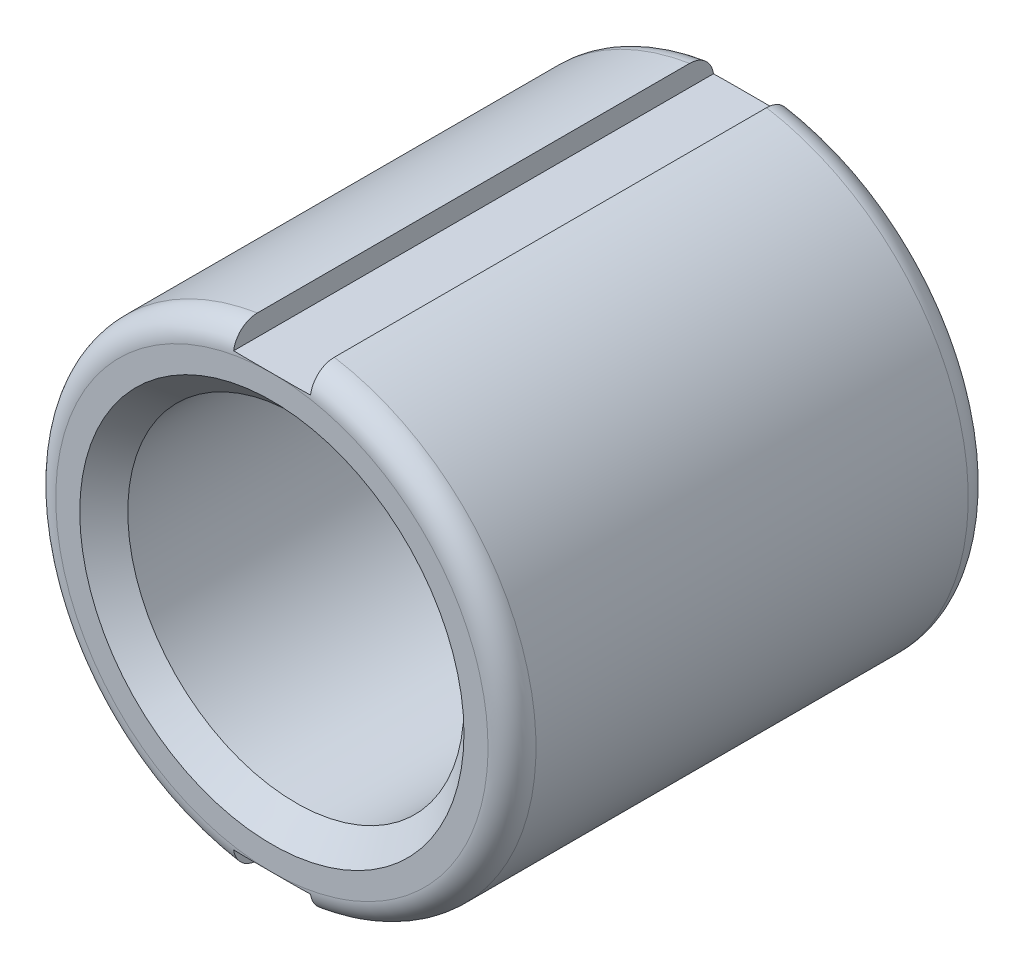
ISO-10303-21;
HEADER;
FILE_DESCRIPTION(('STEP AP214'),'2;1');
FILE_NAME('part.step','',(''),(''),'','','');
FILE_SCHEMA(('AUTOMOTIVE_DESIGN { 1 0 10303 214 1 1 1 1 }'));
ENDSEC;
DATA;
#1=APPLICATION_CONTEXT('core data for automotive mechanical design processes');
#2=APPLICATION_PROTOCOL_DEFINITION('international standard','automotive_design',2000,#1);
#3=PRODUCT_CONTEXT('',#1,'mechanical');
#4=PRODUCT('Part','Part','',(#3));
#5=PRODUCT_RELATED_PRODUCT_CATEGORY('part','',(#4));
#6=PRODUCT_DEFINITION_FORMATION('','',#4);
#7=PRODUCT_DEFINITION_CONTEXT('part definition',#1,'design');
#8=PRODUCT_DEFINITION('design','',#6,#7);
#9=PRODUCT_DEFINITION_SHAPE('','',#8);
#10=(LENGTH_UNIT() NAMED_UNIT(*) SI_UNIT(.MILLI.,.METRE.));
#11=(NAMED_UNIT(*) PLANE_ANGLE_UNIT() SI_UNIT($,.RADIAN.));
#12=(NAMED_UNIT(*) SI_UNIT($,.STERADIAN.) SOLID_ANGLE_UNIT());
#13=UNCERTAINTY_MEASURE_WITH_UNIT(LENGTH_MEASURE(1.E-05),#10,'distance_accuracy_value','');
#14=(GEOMETRIC_REPRESENTATION_CONTEXT(3) GLOBAL_UNCERTAINTY_ASSIGNED_CONTEXT((#13)) GLOBAL_UNIT_ASSIGNED_CONTEXT((#10,
#11,#12)) REPRESENTATION_CONTEXT('',''));
#15=CARTESIAN_POINT('',(0.,0.,0.));
#16=DIRECTION('',(0.,0.,1.));
#17=DIRECTION('',(1.,0.,0.));
#18=AXIS2_PLACEMENT_3D('',#15,#16,#17);
#19=CARTESIAN_POINT('',(0.,0.,0.));
#20=DIRECTION('',(0.,0.,1.));
#21=DIRECTION('',(1.,0.,0.));
#22=AXIS2_PLACEMENT_3D('',#19,#20,#21);
#23=CYLINDRICAL_SURFACE('',#22,5.);
#24=DIRECTION('',(0.,0.,-1.));
#25=VECTOR('',#24,1.);
#26=CARTESIAN_POINT('',(0.8,4.93558507170123,10.));
#27=LINE('',#26,#25);
#28=CARTESIAN_POINT('',(0.8,4.93558507170123,0.5));
#29=VERTEX_POINT('',#28);
#30=CARTESIAN_POINT('',(0.8,4.93558507170123,9.5));
#31=VERTEX_POINT('',#30);
#32=EDGE_CURVE('E111',#29,#31,#27,.F.);
#33=ORIENTED_EDGE('',*,*,#32,.T.);
#34=CARTESIAN_POINT('',(0.,0.,9.5));
#35=DIRECTION('',(0.,0.,1.));
#36=DIRECTION('',(1.,0.,0.));
#37=AXIS2_PLACEMENT_3D('',#34,#35,#36);
#38=CIRCLE('',#37,5.);
#39=CARTESIAN_POINT('',(0.8,-4.93558507170123,9.5));
#40=VERTEX_POINT('',#39);
#41=EDGE_CURVE('E209',#40,#31,#38,.T.);
#42=ORIENTED_EDGE('',*,*,#41,.F.);
#43=DIRECTION('',(0.,0.,-1.));
#44=VECTOR('',#43,1.);
#45=CARTESIAN_POINT('',(0.8,-4.93558507170123,10.));
#46=LINE('',#45,#44);
#47=CARTESIAN_POINT('',(0.8,-4.93558507170123,0.5));
#48=VERTEX_POINT('',#47);
#49=EDGE_CURVE('E210',#40,#48,#46,.T.);
#50=ORIENTED_EDGE('',*,*,#49,.T.);
#51=CARTESIAN_POINT('',(0.,0.,0.5));
#52=DIRECTION('',(0.,0.,-1.));
#53=DIRECTION('',(-1.,0.,0.));
#54=AXIS2_PLACEMENT_3D('',#51,#52,#53);
#55=CIRCLE('',#54,5.);
#56=EDGE_CURVE('E215',#29,#48,#55,.T.);
#57=ORIENTED_EDGE('',*,*,#56,.F.);
#58=EDGE_LOOP('',(#33,#42,#50,#57));
#59=FACE_BOUND('',#58,.T.);
#60=ADVANCED_FACE('F17',(#59),#23,.T.);
#61=CARTESIAN_POINT('',(0.,0.,0.));
#62=DIRECTION('',(0.,0.,1.));
#63=DIRECTION('',(1.,0.,0.));
#64=AXIS2_PLACEMENT_3D('',#61,#62,#63);
#65=CYLINDRICAL_SURFACE('',#64,3.5);
#66=CARTESIAN_POINT('',(0.,0.,0.500000668296252));
#67=DIRECTION('',(0.,0.,-1.));
#68=DIRECTION('',(-1.,0.,0.));
#69=AXIS2_PLACEMENT_3D('',#66,#67,#68);
#70=CIRCLE('',#69,3.5000015562332);
#71=CARTESIAN_POINT('',(-3.5000015562332,0.,0.500000668296252));
#72=VERTEX_POINT('',#71);
#73=EDGE_CURVE('E330',#72,#72,#70,.T.);
#74=ORIENTED_EDGE('',*,*,#73,.T.);
#75=EDGE_LOOP('',(#74));
#76=FACE_BOUND('',#75,.T.);
#77=CARTESIAN_POINT('',(0.,0.,9.4999993317515));
#78=DIRECTION('',(0.,0.,1.));
#79=DIRECTION('',(1.,0.,0.));
#80=AXIS2_PLACEMENT_3D('',#77,#78,#79);
#81=CIRCLE('',#80,3.50000155606267);
#82=CARTESIAN_POINT('',(3.50000155606267,0.,9.4999993317515));
#83=VERTEX_POINT('',#82);
#84=EDGE_CURVE('E188',#83,#83,#81,.T.);
#85=ORIENTED_EDGE('',*,*,#84,.T.);
#86=EDGE_LOOP('',(#85));
#87=FACE_BOUND('',#86,.T.);
#88=ADVANCED_FACE('F220',(#76,#87),#65,.F.);
#89=CARTESIAN_POINT('',(0.8,4.5,10.));
#90=DIRECTION('',(1.,0.,0.));
#91=DIRECTION('',(0.,0.,-1.));
#92=AXIS2_PLACEMENT_3D('',#89,#90,#91);
#93=PLANE('',#92);
#94=ORIENTED_EDGE('',*,*,#32,.F.);
#95=CARTESIAN_POINT('',(0.8,4.50000000000039,0.00500345930993872));
#96=CARTESIAN_POINT('',(0.8,4.52845009813169,0.00897273757396105));
#97=CARTESIAN_POINT('',(0.8,4.55655801465725,0.0153662200912822));
#98=CARTESIAN_POINT('',(0.8,4.6113130072945,0.0327443842024068));
#99=CARTESIAN_POINT('',(0.8,4.63796027567464,0.0437284598763442));
#100=CARTESIAN_POINT('',(0.8,4.68904531073149,0.0700420339840328));
#101=CARTESIAN_POINT('',(0.8,4.7134813391354,0.0853749125676671));
#102=CARTESIAN_POINT('',(0.8,4.75938912629864,0.119956087856805));
#103=CARTESIAN_POINT('',(0.8,4.78086228503292,0.139202524672923));
#104=CARTESIAN_POINT('',(0.8,4.82001371761876,0.180875086695023));
#105=CARTESIAN_POINT('',(0.8,4.83772714171255,0.203268178644543));
#106=CARTESIAN_POINT('',(0.8,4.86909323858901,0.250758707019667));
#107=CARTESIAN_POINT('',(0.8,4.88274369521804,0.275857609205382));
#108=CARTESIAN_POINT('',(0.8,4.90540198417884,0.327686969604477));
#109=CARTESIAN_POINT('',(0.8,4.91446651788921,0.354392689625114));
#110=CARTESIAN_POINT('',(0.8,4.92791605870243,0.408913776939777));
#111=CARTESIAN_POINT('',(0.8,4.93231064652914,0.436726750452957));
#112=CARTESIAN_POINT('',(0.8,4.93516504033238,0.476441709655943));
#113=CARTESIAN_POINT('',(0.8,4.93558824778079,0.48822420578162));
#114=CARTESIAN_POINT('',(0.8,4.93558507170123,0.500000000000001));
#115=B_SPLINE_CURVE_WITH_KNOTS('',3,(#95,#96,#97,#98,#99,#100,#101,#102,#103,#104,#105,#106,
#107,#108,#109,#110,#111,#112,#113,#114),.UNSPECIFIED.,.F.,.F.,(4,2,2,2,2,2,2,2,2,4),(0.,
0.0860724566878337,0.17213355611815,0.258261731565756,0.344349070505498,0.429592175522784,
0.514881691710011,0.59908918782297,0.683123590796544,0.718461358191967),.UNSPECIFIED.);
#116=CARTESIAN_POINT('',(0.800000000000035,4.5000000000002,0.00500345930991209));
#117=VERTEX_POINT('',#116);
#118=EDGE_CURVE('E110',#117,#29,#115,.T.);
#119=ORIENTED_EDGE('',*,*,#118,.F.);
#120=DIRECTION('',(0.,0.,-1.));
#121=VECTOR('',#120,1.);
#122=CARTESIAN_POINT('',(0.8,4.5,10.));
#123=LINE('',#122,#121);
#124=CARTESIAN_POINT('',(0.8,4.5,9.99499654069011));
#125=VERTEX_POINT('',#124);
#126=EDGE_CURVE('E303',#117,#125,#123,.F.);
#127=ORIENTED_EDGE('',*,*,#126,.T.);
#128=CARTESIAN_POINT('',(0.8,4.93558507170123,9.5));
#129=CARTESIAN_POINT('',(0.8,4.93561032605787,9.52785775098437));
#130=CARTESIAN_POINT('',(0.8,4.93322810088451,9.55570642255943));
#131=CARTESIAN_POINT('',(0.8,4.92383695412796,9.61058367841181));
#132=CARTESIAN_POINT('',(0.8,4.9168328966941,9.63761309365178));
#133=CARTESIAN_POINT('',(0.8,4.89838214868909,9.6901215937765));
#134=CARTESIAN_POINT('',(0.8,4.88693378418782,9.71560009032633));
#135=CARTESIAN_POINT('',(0.8,4.85994796647418,9.76428229447974));
#136=CARTESIAN_POINT('',(0.8,4.84441125855866,9.78748641564033));
#137=CARTESIAN_POINT('',(0.8,4.80961256302529,9.83110500215733));
#138=CARTESIAN_POINT('',(0.8,4.7903317823694,9.85150446843207));
#139=CARTESIAN_POINT('',(0.8,4.74864614825345,9.88883476826517));
#140=CARTESIAN_POINT('',(0.8,4.72623960256491,9.9057637106067));
#141=CARTESIAN_POINT('',(0.8,4.67864142629612,9.93589509562028));
#142=CARTESIAN_POINT('',(0.8,4.65341749533544,9.94904645778509));
#143=CARTESIAN_POINT('',(0.8,4.60117360135183,9.97096883261647));
#144=CARTESIAN_POINT('',(0.8,4.57415655687601,9.97974677468078));
#145=CARTESIAN_POINT('',(0.8,4.53121938353573,9.98988187728597));
#146=CARTESIAN_POINT('',(0.8,4.51565627458967,9.99280454830524));
#147=CARTESIAN_POINT('',(0.8,4.5,9.99499654069012));
#148=B_SPLINE_CURVE_WITH_KNOTS('',3,(#128,#129,#130,#131,#132,#133,#134,#135,#136,#137,#138,
#139,#140,#141,#142,#143,#144,#145,#146,#147),.UNSPECIFIED.,.F.,.F.,(4,2,2,2,2,2,2,2,2,4),(0.,
0.0834582007003239,0.166828707373504,0.250230645721877,0.333617390583583,0.417434043094357,
0.50129624969402,0.586244135819235,0.67105699611958,0.718490994234366),.UNSPECIFIED.);
#149=EDGE_CURVE('E189',#31,#125,#148,.T.);
#150=ORIENTED_EDGE('',*,*,#149,.F.);
#151=EDGE_LOOP('',(#94,#119,#127,#150));
#152=FACE_BOUND('',#151,.T.);
#153=ADVANCED_FACE('F216',(#152),#93,.F.);
#154=CARTESIAN_POINT('',(0.,0.,0.499999999999998));
#155=DIRECTION('',(0.,0.,1.));
#156=DIRECTION('',(1.,0.,0.));
#157=AXIS2_PLACEMENT_3D('',#154,#155,#156);
#158=TOROIDAL_SURFACE('',#157,4.5,0.499999999999999);
#159=ORIENTED_EDGE('',*,*,#56,.T.);
#160=CARTESIAN_POINT('',(0.8,-4.93558507170123,0.5));
#161=CARTESIAN_POINT('',(0.8,-4.93561032605788,0.472142249015626));
#162=CARTESIAN_POINT('',(0.8,-4.93322810088451,0.444293577440572));
#163=CARTESIAN_POINT('',(0.8,-4.92383695412796,0.389416321588187));
#164=CARTESIAN_POINT('',(0.8,-4.9168328966941,0.362386906348221));
#165=CARTESIAN_POINT('',(0.8,-4.89838214868909,0.309878406223494));
#166=CARTESIAN_POINT('',(0.8,-4.88693378418783,0.284399909673671));
#167=CARTESIAN_POINT('',(0.8,-4.85994796647419,0.235717705520259));
#168=CARTESIAN_POINT('',(0.8,-4.84441125855866,0.212513584359669));
#169=CARTESIAN_POINT('',(0.8,-4.80961256302529,0.168894997842669));
#170=CARTESIAN_POINT('',(0.8,-4.7903317823694,0.148495531567928));
#171=CARTESIAN_POINT('',(0.8,-4.74864614825345,0.111165231734834));
#172=CARTESIAN_POINT('',(0.8,-4.72623960256491,0.0942362893933036));
#173=CARTESIAN_POINT('',(0.8,-4.67864142629612,0.0641049043797164));
#174=CARTESIAN_POINT('',(0.8,-4.65341749533544,0.0509535422149144));
#175=CARTESIAN_POINT('',(0.8,-4.60117360135183,0.029031167383524));
#176=CARTESIAN_POINT('',(0.8,-4.57415655687601,0.0202532253192213));
#177=CARTESIAN_POINT('',(0.8,-4.53121938353573,0.01011812271403));
#178=CARTESIAN_POINT('',(0.8,-4.51565627458967,0.00719545169475767));
#179=CARTESIAN_POINT('',(0.8,-4.5,0.0050034593098837));
#180=B_SPLINE_CURVE_WITH_KNOTS('',3,(#160,#161,#162,#163,#164,#165,#166,#167,#168,#169,#170,
#171,#172,#173,#174,#175,#176,#177,#178,#179),.UNSPECIFIED.,.F.,.F.,(4,2,2,2,2,2,2,2,2,4),(0.,
0.0834582007003237,0.166828707373503,0.250230645721875,0.333617390583583,0.417434043094357,
0.501296249694018,0.586244135819233,0.67105699611958,0.71849099423437),.UNSPECIFIED.);
#181=CARTESIAN_POINT('',(0.8,-4.5,0.00500345930988396));
#182=VERTEX_POINT('',#181);
#183=EDGE_CURVE('E108',#48,#182,#180,.T.);
#184=ORIENTED_EDGE('',*,*,#183,.T.);
#185=CARTESIAN_POINT('',(0.8,-4.5,0.00500345930988385));
#186=CARTESIAN_POINT('',(0.733344506557293,-4.5,0.0033663492276476));
#187=CARTESIAN_POINT('',(0.666680551744092,-4.5,0.00229903633764223));
#188=CARTESIAN_POINT('',(0.533346670210533,-4.5,0.000878165482210462));
#189=CARTESIAN_POINT('',(0.466676743790579,-4.5,0.000524581887966322));
#190=CARTESIAN_POINT('',(0.333340130833498,-4.5,0.000105283347925185));
#191=CARTESIAN_POINT('',(0.266673444287652,-4.5,3.95552367685691E-05));
#192=CARTESIAN_POINT('',(0.133337899336369,-4.5,-8.2602312148946E-08));
#193=CARTESIAN_POINT('',(0.066669040928656,-4.5,2.60105615179282E-05));
#194=CARTESIAN_POINT('',(1.49090468649038E-08,-4.5,0.));
#195=B_SPLINE_CURVE_WITH_KNOTS('',3,(#185,#186,#187,#188,#189,#190,#191,#192,#193,#194),
.UNSPECIFIED.,.F.,.F.,(4,2,2,2,4),(0.,0.200016739061593,0.400026295730958,0.600026704666838,
0.800033412330266),.UNSPECIFIED.);
#196=CARTESIAN_POINT('',(9.93936330502778E-09,-4.50000000007172,0.));
#197=VERTEX_POINT('',#196);
#198=EDGE_CURVE('E22',#182,#197,#195,.T.);
#199=ORIENTED_EDGE('',*,*,#198,.T.);
#200=CARTESIAN_POINT('',(0.,0.,0.));
#201=DIRECTION('',(0.,0.,1.));
#202=DIRECTION('',(1.,0.,0.));
#203=AXIS2_PLACEMENT_3D('',#200,#201,#202);
#204=CIRCLE('',#203,4.50000000014344);
#205=CARTESIAN_POINT('',(-1.10222400979637E-08,4.50000000005369,0.));
#206=VERTEX_POINT('',#205);
#207=EDGE_CURVE('E105',#197,#206,#204,.T.);
#208=ORIENTED_EDGE('',*,*,#207,.T.);
#209=CARTESIAN_POINT('',(-2.20444813050395E-08,4.5,0.));
#210=CARTESIAN_POINT('',(0.0666690070545186,4.5,2.60105664174248E-05));
#211=CARTESIAN_POINT('',(0.133337868541531,4.5,-8.26023107872413E-08));
#212=CARTESIAN_POINT('',(0.26667341965142,4.5,3.95552148983217E-05));
#213=CARTESIAN_POINT('',(0.333340109276574,4.5,0.000105283309081953));
#214=CARTESIAN_POINT('',(0.466676728392722,4.5,0.000524581810621204));
#215=CARTESIAN_POINT('',(0.533346657892435,4.5,0.000878165383336557));
#216=CARTESIAN_POINT('',(0.666680545585347,4.5,0.00229903624138613));
#217=CARTESIAN_POINT('',(0.733344503478141,4.5,0.00336634915553947));
#218=CARTESIAN_POINT('',(0.800000000000071,4.5,0.00500345930988065));
#219=B_SPLINE_CURVE_WITH_KNOTS('',3,(#209,#210,#211,#212,#213,#214,#215,#216,#217,#218),
.UNSPECIFIED.,.F.,.F.,(4,2,2,2,4),(0.,0.200006716901429,0.400007135075256,0.600016700983217,
0.800033449283664),.UNSPECIFIED.);
#220=EDGE_CURVE('E190',#206,#117,#219,.T.);
#221=ORIENTED_EDGE('',*,*,#220,.T.);
#222=ORIENTED_EDGE('',*,*,#118,.T.);
#223=EDGE_LOOP('',(#159,#184,#199,#208,#221,#222));
#224=FACE_BOUND('',#223,.T.);
#225=ADVANCED_FACE('F103',(#224),#158,.T.);
#226=CARTESIAN_POINT('',(0.,0.,5.6843418860808E-11));
#227=DIRECTION('',(0.,0.,-1.));
#228=DIRECTION('',(-1.,0.,0.));
#229=AXIS2_PLACEMENT_3D('',#226,#227,#228);
#230=CONICAL_SURFACE('',#229,4.00000254222732,0.785398481151634);
#231=ORIENTED_EDGE('',*,*,#73,.F.);
#232=EDGE_LOOP('',(#231));
#233=FACE_BOUND('',#232,.T.);
#234=CARTESIAN_POINT('',(0.,0.,5.6843418860808E-11));
#235=DIRECTION('',(0.,0.,-1.));
#236=DIRECTION('',(-1.,0.,0.));
#237=AXIS2_PLACEMENT_3D('',#234,#235,#236);
#238=CIRCLE('',#237,4.00000254222732);
#239=CARTESIAN_POINT('',(-4.00000254222732,0.,5.6843418860808E-11));
#240=VERTEX_POINT('',#239);
#241=EDGE_CURVE('E118',#240,#240,#238,.T.);
#242=ORIENTED_EDGE('',*,*,#241,.T.);
#243=EDGE_LOOP('',(#242));
#244=FACE_BOUND('',#243,.T.);
#245=ADVANCED_FACE('F203',(#233,#244),#230,.F.);
#246=CARTESIAN_POINT('',(0.8,-5.5,10.));
#247=DIRECTION('',(1.,0.,0.));
#248=DIRECTION('',(0.,0.,-1.));
#249=AXIS2_PLACEMENT_3D('',#246,#247,#248);
#250=PLANE('',#249);
#251=ORIENTED_EDGE('',*,*,#49,.F.);
#252=CARTESIAN_POINT('',(0.8,-4.50000000000067,9.99499654069002));
#253=CARTESIAN_POINT('',(0.8,-4.52845009813196,9.99102726242598));
#254=CARTESIAN_POINT('',(0.8,-4.55655801465752,9.98463377990865));
#255=CARTESIAN_POINT('',(0.8,-4.61131300729476,9.96725561579749));
#256=CARTESIAN_POINT('',(0.8,-4.63796027567489,9.95627154012354));
#257=CARTESIAN_POINT('',(0.8,-4.68904531073172,9.92995796601583));
#258=CARTESIAN_POINT('',(0.8,-4.71348133913562,9.91462508743218));
#259=CARTESIAN_POINT('',(0.8,-4.75938912629885,9.88004391214302));
#260=CARTESIAN_POINT('',(0.8,-4.78086228503312,9.86079747532689));
#261=CARTESIAN_POINT('',(0.8,-4.82001371761894,9.81912491330477));
#262=CARTESIAN_POINT('',(0.8,-4.83772714171271,9.79673182135524));
#263=CARTESIAN_POINT('',(0.8,-4.86909323858914,9.7492412929801));
#264=CARTESIAN_POINT('',(0.8,-4.88274369521817,9.72414239079438));
#265=CARTESIAN_POINT('',(0.8,-4.90540198417894,9.67231303039527));
#266=CARTESIAN_POINT('',(0.8,-4.91446651788929,9.64560731037463));
#267=CARTESIAN_POINT('',(0.8,-4.92791605870248,9.59108622305996));
#268=CARTESIAN_POINT('',(0.8,-4.93231064652917,9.56327324954678));
#269=CARTESIAN_POINT('',(0.8,-4.93516504033239,9.52355829034388));
#270=CARTESIAN_POINT('',(0.8,-4.93558824778079,9.51177579421829));
#271=CARTESIAN_POINT('',(0.8,-4.93558507170123,9.5));
#272=B_SPLINE_CURVE_WITH_KNOTS('',3,(#252,#253,#254,#255,#256,#257,#258,#259,#260,#261,#262,
#263,#264,#265,#266,#267,#268,#269,#270,#271),.UNSPECIFIED.,.F.,.F.,(4,2,2,2,2,2,2,2,2,4),(0.,
0.086072456687831,0.172133556118147,0.258261731565753,0.344349070505492,0.429592175522776,
0.514881691710001,0.599089187822962,0.683123590796533,0.718461358191688),.UNSPECIFIED.);
#273=CARTESIAN_POINT('',(0.80000000000006,-4.50000000000033,9.99499654069007));
#274=VERTEX_POINT('',#273);
#275=EDGE_CURVE('E182',#274,#40,#272,.T.);
#276=ORIENTED_EDGE('',*,*,#275,.F.);
#277=DIRECTION('',(0.,0.,1.));
#278=VECTOR('',#277,1.);
#279=CARTESIAN_POINT('',(0.800000000000001,-4.5,10.));
#280=LINE('',#279,#278);
#281=EDGE_CURVE('E151',#274,#182,#280,.F.);
#282=ORIENTED_EDGE('',*,*,#281,.T.);
#283=ORIENTED_EDGE('',*,*,#183,.F.);
#284=EDGE_LOOP('',(#251,#276,#282,#283));
#285=FACE_BOUND('',#284,.T.);
#286=ADVANCED_FACE('F164',(#285),#250,.F.);
#287=CARTESIAN_POINT('',(0.,0.,9.5));
#288=DIRECTION('',(0.,0.,1.));
#289=DIRECTION('',(1.,0.,0.));
#290=AXIS2_PLACEMENT_3D('',#287,#288,#289);
#291=TOROIDAL_SURFACE('',#290,4.5,0.5);
#292=CARTESIAN_POINT('',(1.62758198528307E-05,-4.50000005458983,10.0000000545898));
#293=CARTESIAN_POINT('',(0.066683946777847,-4.50000001971275,9.99997401130688));
#294=CARTESIAN_POINT('',(0.133351450166399,-4.50000000530721,10.0000000879096));
#295=CARTESIAN_POINT('',(0.266684285084998,-4.49999999469296,9.99996042983179));
#296=CARTESIAN_POINT('',(0.333349616617321,-4.49999999848367,9.99989469804262));
#297=CARTESIAN_POINT('',(0.466683519390653,-4.5000000015164,9.99947538559313));
#298=CARTESIAN_POINT('',(0.533352090640376,-4.50000000075821,9.99912179176711));
#299=CARTESIAN_POINT('',(0.666683261862751,-4.49999999924176,9.9977009205472));
#300=CARTESIAN_POINT('',(0.733345861535006,-4.49999999848349,9.99663361752556));
#301=CARTESIAN_POINT('',(0.800000000000121,-4.5,9.99499654069012));
#302=B_SPLINE_CURVE_WITH_KNOTS('',3,(#292,#293,#294,#295,#296,#297,#298,#299,#300,#301),
.UNSPECIFIED.,.F.,.F.,(4,2,2,2,4),(0.,0.200002642564528,0.399998986447587,0.600004477907052,
0.800017151513118),.UNSPECIFIED.);
#303=CARTESIAN_POINT('',(1.30206558823996E-05,-4.50000017456554,10.));
#304=VERTEX_POINT('',#303);
#305=EDGE_CURVE('E144',#304,#274,#302,.T.);
#306=ORIENTED_EDGE('',*,*,#305,.T.);
#307=ORIENTED_EDGE('',*,*,#275,.T.);
#308=ORIENTED_EDGE('',*,*,#41,.T.);
#309=ORIENTED_EDGE('',*,*,#149,.T.);
#310=CARTESIAN_POINT('',(0.800000000000001,4.5,9.99499654069012));
#311=CARTESIAN_POINT('',(0.733343131936565,4.5,9.99663368296244));
#312=CARTESIAN_POINT('',(0.66667780233715,4.5,9.99770100663277));
#313=CARTESIAN_POINT('',(0.533341171156878,4.5,9.99912187865667));
#314=CARTESIAN_POINT('',(0.466669869876428,4.5,9.99947545263968));
#315=CARTESIAN_POINT('',(0.333330507400085,4.5,9.99989473399157));
#316=CARTESIAN_POINT('',(0.266662446195466,4.5,9.99996045452587));
#317=CARTESIAN_POINT('',(0.133324151930512,4.5,10.0000000826015));
#318=CARTESIAN_POINT('',(0.0666539188679005,4.5,9.99997398725129));
#319=CARTESIAN_POINT('',(-1.64818476221269E-05,4.5,10.));
#320=B_SPLINE_CURVE_WITH_KNOTS('',3,(#310,#311,#312,#313,#314,#315,#316,#317,#318,#319),
.UNSPECIFIED.,.F.,.F.,(4,2,2,2,4),(0.,0.200020863453622,0.400034544399552,0.60003907732304,
0.800049908997521),.UNSPECIFIED.);
#321=CARTESIAN_POINT('',(-1.64804799260263E-05,4.5000001097127,9.99999999999997));
#322=VERTEX_POINT('',#321);
#323=EDGE_CURVE('E174',#125,#322,#320,.T.);
#324=ORIENTED_EDGE('',*,*,#323,.T.);
#325=CARTESIAN_POINT('',(1.62758198530875E-05,-4.50000021820692,10.));
#326=CARTESIAN_POINT('',(0.857851058751881,-4.49999736531634,10.));
#327=CARTESIAN_POINT('',(1.65644149103543,-4.18404167162007,10.));
#328=CARTESIAN_POINT('',(2.07972243957404,-4.01657406830617,10.));
#329=CARTESIAN_POINT('',(2.46245775763847,-3.76647117339286,10.));
#330=CARTESIAN_POINT('',(2.85168483583712,-3.51212616147069,10.));
#331=CARTESIAN_POINT('',(3.1819923370543,-3.18196923243312,10.));
#332=CARTESIAN_POINT('',(3.5108332042635,-2.85327826883174,10.));
#333=CARTESIAN_POINT('',(3.76648907052002,-2.46243042024408,10.));
#334=CARTESIAN_POINT('',(4.01561923659616,-2.08155909170807,10.));
#335=CARTESIAN_POINT('',(4.18405373919687,-1.65641112798503,10.));
#336=CARTESIAN_POINT('',(4.49980561761339,-0.859417245628622,10.));
#337=CARTESIAN_POINT('',(4.50000039144437,1.63781499126769E-05,10.));
#338=CARTESIAN_POINT('',(4.50019468992715,0.857352542368111,10.));
#339=CARTESIAN_POINT('',(4.18404168177605,1.65644158445212,10.));
#340=CARTESIAN_POINT('',(4.0165740567291,2.07972252952823,10.));
#341=CARTESIAN_POINT('',(3.76647114595305,2.46245783726888,10.));
#342=CARTESIAN_POINT('',(3.51212611640777,2.85168490725083,10.));
#343=CARTESIAN_POINT('',(3.18196917485231,3.18199239499163,10.));
#344=CARTESIAN_POINT('',(2.85327819769278,3.51083324988062,10.));
#345=CARTESIAN_POINT('',(2.4624303407623,3.76648909864916,10.));
#346=CARTESIAN_POINT('',(2.08155892675873,4.01561929827073,10.));
#347=CARTESIAN_POINT('',(1.65641103461087,4.18405373019566,10.));
#348=CARTESIAN_POINT('',(0.858917432259905,4.50000350757108,10.));
#349=CARTESIAN_POINT('',(-1.64804799263147E-05,4.50000021942539,10.));
#350=B_SPLINE_CURVE_WITH_KNOTS('',2,(#325,#326,#327,#328,#329,#330,#331,#332,#333,#334,#335,
#336,#337,#338,#339,#340,#341,#342,#343,#344,#345,#346,#347,#348,#349),.UNSPECIFIED.,.F.,.F.,(3,
2,2,2,2,2,2,2,2,2,2,2,3),(0.,0.125,0.1875,0.25,0.3125,0.375,0.5,0.625,0.6875,0.75,0.8125,0.875,
1.),.UNSPECIFIED.);
#351=EDGE_CURVE('E143',#304,#322,#350,.T.);
#352=ORIENTED_EDGE('',*,*,#351,.F.);
#353=EDGE_LOOP('',(#306,#307,#308,#309,#324,#352));
#354=FACE_BOUND('',#353,.T.);
#355=ADVANCED_FACE('F160',(#354),#291,.T.);
#356=CARTESIAN_POINT('',(0.,0.,9.99999999993406));
#357=DIRECTION('',(0.,0.,1.));
#358=DIRECTION('',(1.,0.,0.));
#359=AXIS2_PLACEMENT_3D('',#356,#357,#358);
#360=CONICAL_SURFACE('',#359,4.00000254199995,0.785398481094791);
#361=ORIENTED_EDGE('',*,*,#84,.F.);
#362=EDGE_LOOP('',(#361));
#363=FACE_BOUND('',#362,.T.);
#364=CARTESIAN_POINT('',(0.,0.,9.99999999999091));
#365=DIRECTION('',(0.,0.,1.));
#366=DIRECTION('',(1.,0.,0.));
#367=AXIS2_PLACEMENT_3D('',#364,#365,#366);
#368=CIRCLE('',#367,4.00000254205679);
#369=CARTESIAN_POINT('',(4.00000254205679,0.,9.99999999999091));
#370=VERTEX_POINT('',#369);
#371=EDGE_CURVE('E134',#370,#370,#368,.F.);
#372=ORIENTED_EDGE('',*,*,#371,.F.);
#373=EDGE_LOOP('',(#372));
#374=FACE_BOUND('',#373,.T.);
#375=ADVANCED_FACE('F163',(#363,#374),#360,.F.);
#376=CARTESIAN_POINT('',(-0.8,4.5,10.));
#377=DIRECTION('',(0.,-1.,0.));
#378=DIRECTION('',(0.,0.,-1.));
#379=AXIS2_PLACEMENT_3D('',#376,#377,#378);
#380=PLANE('',#379);
#381=DIRECTION('',(0.,0.,1.));
#382=VECTOR('',#381,1.);
#383=CARTESIAN_POINT('',(-0.8,4.5,10.));
#384=LINE('',#383,#382);
#385=CARTESIAN_POINT('',(-0.8,4.5,0.00500345930988523));
#386=VERTEX_POINT('',#385);
#387=CARTESIAN_POINT('',(-0.80000000000006,4.5,9.99499654069011));
#388=VERTEX_POINT('',#387);
#389=EDGE_CURVE('E131',#386,#388,#384,.T.);
#390=ORIENTED_EDGE('',*,*,#389,.T.);
#391=CARTESIAN_POINT('',(-1.64804799259004E-05,4.50000005481825,10.0000000548182));
#392=CARTESIAN_POINT('',(-0.0666841343832538,4.50000001979523,9.99997401141649));
#393=CARTESIAN_POINT('',(-0.133351620717657,4.50000000532942,10.0000000879318));
#394=CARTESIAN_POINT('',(-0.266684421527948,4.49999999467075,9.99996042968845));
#395=CARTESIAN_POINT('',(-0.333349736006114,4.49999999847732,9.99989469782114));
#396=CARTESIAN_POINT('',(-0.466683604668805,4.50000000152275,9.9994753851711));
#397=CARTESIAN_POINT('',(-0.533352158862044,4.50000000076139,9.99912179122267));
#398=CARTESIAN_POINT('',(-0.666683295972188,4.49999999923859,9.99770092001092));
#399=CARTESIAN_POINT('',(-0.733345878588697,4.49999999847715,9.99663361711985));
#400=CARTESIAN_POINT('',(-0.80000000000012,4.5,9.99499654069012));
#401=B_SPLINE_CURVE_WITH_KNOTS('',3,(#391,#392,#393,#394,#395,#396,#397,#398,#399,#400),
.UNSPECIFIED.,.F.,.F.,(4,2,2,2,4),(0.,0.200002591401523,0.399998884121964,0.600004324415762,
0.800016946854176),.UNSPECIFIED.);
#402=EDGE_CURVE('E296',#322,#388,#401,.T.);
#403=ORIENTED_EDGE('',*,*,#402,.F.);
#404=ORIENTED_EDGE('',*,*,#323,.F.);
#405=ORIENTED_EDGE('',*,*,#126,.F.);
#406=ORIENTED_EDGE('',*,*,#220,.F.);
#407=CARTESIAN_POINT('',(-0.799999999999999,4.5,0.00500345930988524));
#408=CARTESIAN_POINT('',(-0.733344507151864,4.5,0.00336634924157253));
#409=CARTESIAN_POINT('',(-0.666680552933308,4.5,0.0022990363562301));
#410=CARTESIAN_POINT('',(-0.533346672589069,4.5,0.000878165501303778));
#411=CARTESIAN_POINT('',(-0.466676746763792,4.5,0.000524581902902408));
#412=CARTESIAN_POINT('',(-0.333340134995976,4.5,0.000105283355426737));
#413=CARTESIAN_POINT('',(-0.266673449044718,4.5,3.95552409928393E-05));
#414=CARTESIAN_POINT('',(-0.133337905282612,4.5,-8.26023109671498E-08));
#415=CARTESIAN_POINT('',(-0.0666690474694857,4.5,2.60105605733977E-05));
#416=CARTESIAN_POINT('',(-2.20444814776575E-08,4.5,0.));
#417=B_SPLINE_CURVE_WITH_KNOTS('',3,(#407,#408,#409,#410,#411,#412,#413,#414,#415,#416),
.UNSPECIFIED.,.F.,.F.,(4,2,2,2,4),(0.,0.200016737277647,0.400026292163115,0.600026699315223,
0.800033405194869),.UNSPECIFIED.);
#418=EDGE_CURVE('E119',#386,#206,#417,.T.);
#419=ORIENTED_EDGE('',*,*,#418,.F.);
#420=EDGE_LOOP('',(#390,#403,#404,#405,#406,#419));
#421=FACE_BOUND('',#420,.T.);
#422=ADVANCED_FACE('F297',(#421),#380,.F.);
#423=CARTESIAN_POINT('',(0.,0.,0.));
#424=DIRECTION('',(0.,0.,1.));
#425=DIRECTION('',(1.,0.,0.));
#426=AXIS2_PLACEMENT_3D('',#423,#424,#425);
#427=PLANE('',#426);
#428=ORIENTED_EDGE('',*,*,#241,.F.);
#429=EDGE_LOOP('',(#428));
#430=FACE_BOUND('',#429,.T.);
#431=CARTESIAN_POINT('',(0.,0.,0.));
#432=DIRECTION('',(0.,0.,1.));
#433=DIRECTION('',(0.,-1.,0.));
#434=AXIS2_PLACEMENT_3D('',#431,#432,#433);
#435=CIRCLE('',#434,4.50000000010738);
#436=EDGE_CURVE('E116',#206,#197,#435,.T.);
#437=ORIENTED_EDGE('',*,*,#436,.F.);
#438=ORIENTED_EDGE('',*,*,#207,.F.);
#439=EDGE_LOOP('',(#437,#438));
#440=FACE_BOUND('',#439,.T.);
#441=ADVANCED_FACE('F114',(#430,#440),#427,.F.);
#442=CARTESIAN_POINT('',(0.8,-4.5,10.));
#443=DIRECTION('',(0.,1.,0.));
#444=DIRECTION('',(0.,0.,1.));
#445=AXIS2_PLACEMENT_3D('',#442,#443,#444);
#446=PLANE('',#445);
#447=ORIENTED_EDGE('',*,*,#281,.F.);
#448=ORIENTED_EDGE('',*,*,#305,.F.);
#449=CARTESIAN_POINT('',(-0.800000000000001,-4.5,9.99499654069011));
#450=CARTESIAN_POINT('',(-0.733343148990694,-4.5,9.99663368256308));
#451=CARTESIAN_POINT('',(-0.666677836447461,-4.5,9.99770100609966));
#452=CARTESIAN_POINT('',(-0.533341239380474,-4.5,9.99912187810907));
#453=CARTESIAN_POINT('',(-0.466669955157128,-4.5,9.99947545221132));
#454=CARTESIAN_POINT('',(-0.333330626792488,-4.5,9.99989473377646));
#455=CARTESIAN_POINT('',(-0.266662582642471,-4.5,9.99996045440476));
#456=CARTESIAN_POINT('',(-0.13332432248667,-4.5,10.0000000826015));
#457=CARTESIAN_POINT('',(-0.0666541064786112,-4.5,9.99997398727842));
#458=CARTESIAN_POINT('',(1.62771818500677E-05,-4.5,10.));
#459=B_SPLINE_CURVE_WITH_KNOTS('',3,(#449,#450,#451,#452,#453,#454,#455,#456,#457,#458),
.UNSPECIFIED.,.F.,.F.,(4,2,2,2,4),(0.,0.200020812284663,0.400034442063066,0.600038923822611,
0.800049704332859),.UNSPECIFIED.);
#460=CARTESIAN_POINT('',(-0.800000000000001,-4.5,9.99499654069011));
#461=VERTEX_POINT('',#460);
#462=EDGE_CURVE('E152',#461,#304,#459,.T.);
#463=ORIENTED_EDGE('',*,*,#462,.F.);
#464=DIRECTION('',(0.,0.,1.));
#465=VECTOR('',#464,1.);
#466=CARTESIAN_POINT('',(-0.8,-4.5,10.));
#467=LINE('',#466,#465);
#468=CARTESIAN_POINT('',(-0.800000000000035,-4.5,0.00500345930988579));
#469=VERTEX_POINT('',#468);
#470=EDGE_CURVE('E124',#461,#469,#467,.F.);
#471=ORIENTED_EDGE('',*,*,#470,.T.);
#472=CARTESIAN_POINT('',(1.49090467550158E-08,-4.5,0.));
#473=CARTESIAN_POINT('',(-0.0666690135953483,-4.5,2.60105654720587E-05));
#474=CARTESIAN_POINT('',(-0.133337874487773,-4.5,-8.26023103930765E-08));
#475=CARTESIAN_POINT('',(-0.266673424408487,-4.5,3.95552191219547E-05));
#476=CARTESIAN_POINT('',(-0.333340113439052,-4.5,0.00010528331658297));
#477=CARTESIAN_POINT('',(-0.466676731365935,-4.5,0.000524581825556797));
#478=CARTESIAN_POINT('',(-0.533346660270972,-4.5,0.00087816540242932));
#479=CARTESIAN_POINT('',(-0.666680546774564,-4.5,0.00229903625997338));
#480=CARTESIAN_POINT('',(-0.733344504072713,-4.5,0.00336634916946377));
#481=CARTESIAN_POINT('',(-0.800000000000071,-4.5,0.00500345930988154));
#482=B_SPLINE_CURVE_WITH_KNOTS('',3,(#472,#473,#474,#475,#476,#477,#478,#479,#480,#481),
.UNSPECIFIED.,.F.,.F.,(4,2,2,2,4),(0.,0.200006715117647,0.400007131507703,0.600016695631767,
0.800033442148268),.UNSPECIFIED.);
#483=EDGE_CURVE('E122',#197,#469,#482,.T.);
#484=ORIENTED_EDGE('',*,*,#483,.F.);
#485=ORIENTED_EDGE('',*,*,#198,.F.);
#486=EDGE_LOOP('',(#447,#448,#463,#471,#484,#485));
#487=FACE_BOUND('',#486,.T.);
#488=ADVANCED_FACE('F123',(#487),#446,.F.);
#489=CARTESIAN_POINT('',(0.,0.,10.));
#490=DIRECTION('',(0.,0.,1.));
#491=DIRECTION('',(1.,0.,0.));
#492=AXIS2_PLACEMENT_3D('',#489,#490,#491);
#493=PLANE('',#492);
#494=ORIENTED_EDGE('',*,*,#371,.T.);
#495=EDGE_LOOP('',(#494));
#496=FACE_BOUND('',#495,.T.);
#497=ORIENTED_EDGE('',*,*,#351,.T.);
#498=CARTESIAN_POINT('',(0.,0.,9.99999999999995));
#499=DIRECTION('',(0.,0.,1.));
#500=DIRECTION('',(1.,0.,0.));
#501=AXIS2_PLACEMENT_3D('',#498,#499,#500);
#502=CIRCLE('',#501,4.50000021823635);
#503=EDGE_CURVE('E292',#304,#322,#502,.F.);
#504=ORIENTED_EDGE('',*,*,#503,.F.);
#505=EDGE_LOOP('',(#497,#504));
#506=FACE_BOUND('',#505,.T.);
#507=ADVANCED_FACE('F272',(#496,#506),#493,.T.);
#508=CARTESIAN_POINT('',(-0.8,5.5,10.));
#509=DIRECTION('',(-1.,0.,0.));
#510=DIRECTION('',(0.,0.,1.));
#511=AXIS2_PLACEMENT_3D('',#508,#509,#510);
#512=PLANE('',#511);
#513=DIRECTION('',(0.,0.,1.));
#514=VECTOR('',#513,1.);
#515=CARTESIAN_POINT('',(-0.800000000000009,4.93558507170123,0.));
#516=LINE('',#515,#514);
#517=CARTESIAN_POINT('',(-0.800000000000005,4.93558507170123,9.5));
#518=VERTEX_POINT('',#517);
#519=CARTESIAN_POINT('',(-0.800000000000005,4.93558507170123,0.5));
#520=VERTEX_POINT('',#519);
#521=EDGE_CURVE('E264',#518,#520,#516,.F.);
#522=ORIENTED_EDGE('',*,*,#521,.F.);
#523=CARTESIAN_POINT('',(-0.8,4.50000000000067,9.99499654069002));
#524=CARTESIAN_POINT('',(-0.8,4.52845009813196,9.99102726242598));
#525=CARTESIAN_POINT('',(-0.8,4.55655801465752,9.98463377990865));
#526=CARTESIAN_POINT('',(-0.8,4.61131300729476,9.96725561579749));
#527=CARTESIAN_POINT('',(-0.8,4.63796027567489,9.95627154012354));
#528=CARTESIAN_POINT('',(-0.8,4.68904531073172,9.92995796601583));
#529=CARTESIAN_POINT('',(-0.8,4.71348133913562,9.91462508743218));
#530=CARTESIAN_POINT('',(-0.8,4.75938912629885,9.88004391214302));
#531=CARTESIAN_POINT('',(-0.8,4.78086228503312,9.86079747532689));
#532=CARTESIAN_POINT('',(-0.8,4.82001371761894,9.81912491330477));
#533=CARTESIAN_POINT('',(-0.8,4.83772714171271,9.79673182135524));
#534=CARTESIAN_POINT('',(-0.8,4.86909323858914,9.7492412929801));
#535=CARTESIAN_POINT('',(-0.8,4.88274369521817,9.72414239079438));
#536=CARTESIAN_POINT('',(-0.8,4.90540198417894,9.67231303039527));
#537=CARTESIAN_POINT('',(-0.8,4.91446651788929,9.64560731037463));
#538=CARTESIAN_POINT('',(-0.8,4.92791605870248,9.59108622305996));
#539=CARTESIAN_POINT('',(-0.8,4.93231064652917,9.56327324954678));
#540=CARTESIAN_POINT('',(-0.8,4.93516504033239,9.52355829034388));
#541=CARTESIAN_POINT('',(-0.8,4.93558824778079,9.51177579421829));
#542=CARTESIAN_POINT('',(-0.8,4.93558507170123,9.5));
#543=B_SPLINE_CURVE_WITH_KNOTS('',3,(#523,#524,#525,#526,#527,#528,#529,#530,#531,#532,#533,
#534,#535,#536,#537,#538,#539,#540,#541,#542),.UNSPECIFIED.,.F.,.F.,(4,2,2,2,2,2,2,2,2,4),(0.,
0.0860724566878318,0.172133556118147,0.258261731565751,0.344349070505493,0.429592175522777,
0.51488169171,0.599089187822962,0.683123590796532,0.718461358191686),.UNSPECIFIED.);
#544=EDGE_CURVE('E324',#388,#518,#543,.T.);
#545=ORIENTED_EDGE('',*,*,#544,.F.);
#546=ORIENTED_EDGE('',*,*,#389,.F.);
#547=CARTESIAN_POINT('',(-0.8,4.93558507170123,0.5));
#548=CARTESIAN_POINT('',(-0.8,4.93561032605788,0.472142249015626));
#549=CARTESIAN_POINT('',(-0.8,4.93322810088451,0.444293577440572));
#550=CARTESIAN_POINT('',(-0.8,4.92383695412796,0.389416321588187));
#551=CARTESIAN_POINT('',(-0.8,4.9168328966941,0.36238690634822));
#552=CARTESIAN_POINT('',(-0.8,4.8983821486891,0.309878406223493));
#553=CARTESIAN_POINT('',(-0.8,4.88693378418783,0.28439990967367));
#554=CARTESIAN_POINT('',(-0.8,4.85994796647419,0.235717705520258));
#555=CARTESIAN_POINT('',(-0.8,4.84441125855866,0.212513584359668));
#556=CARTESIAN_POINT('',(-0.8,4.80961256302529,0.168894997842668));
#557=CARTESIAN_POINT('',(-0.8,4.7903317823694,0.148495531567928));
#558=CARTESIAN_POINT('',(-0.8,4.74864614825345,0.111165231734833));
#559=CARTESIAN_POINT('',(-0.8,4.72623960256491,0.0942362893933025));
#560=CARTESIAN_POINT('',(-0.8,4.67864142629612,0.0641049043797156));
#561=CARTESIAN_POINT('',(-0.8,4.65341749533544,0.0509535422149139));
#562=CARTESIAN_POINT('',(-0.8,4.60117360135183,0.0290311673835241));
#563=CARTESIAN_POINT('',(-0.8,4.57415655687601,0.0202532253192217));
#564=CARTESIAN_POINT('',(-0.8,4.53121938353572,0.010118122714031));
#565=CARTESIAN_POINT('',(-0.8,4.51565627458967,0.00719545169475899));
#566=CARTESIAN_POINT('',(-0.8,4.5,0.0050034593098852));
#567=B_SPLINE_CURVE_WITH_KNOTS('',3,(#547,#548,#549,#550,#551,#552,#553,#554,#555,#556,#557,
#558,#559,#560,#561,#562,#563,#564,#565,#566),.UNSPECIFIED.,.F.,.F.,(4,2,2,2,2,2,2,2,2,4),(0.,
0.0834582007003243,0.166828707373504,0.250230645721876,0.333617390583586,0.417434043094359,
0.50129624969402,0.586244135819236,0.671056996119583,0.718490994234369),.UNSPECIFIED.);
#568=EDGE_CURVE('E127',#520,#386,#567,.T.);
#569=ORIENTED_EDGE('',*,*,#568,.F.);
#570=EDGE_LOOP('',(#522,#545,#546,#569));
#571=FACE_BOUND('',#570,.T.);
#572=ADVANCED_FACE('F244',(#571),#512,.F.);
#573=CARTESIAN_POINT('',(0.,0.,0.5));
#574=DIRECTION('',(0.,0.,1.));
#575=DIRECTION('',(0.,-1.,0.));
#576=AXIS2_PLACEMENT_3D('',#573,#574,#575);
#577=TOROIDAL_SURFACE('',#576,4.5,0.5);
#578=ORIENTED_EDGE('',*,*,#568,.T.);
#579=ORIENTED_EDGE('',*,*,#418,.T.);
#580=ORIENTED_EDGE('',*,*,#436,.T.);
#581=ORIENTED_EDGE('',*,*,#483,.T.);
#582=CARTESIAN_POINT('',(-0.8,-4.50000000000039,0.00500345930993949));
#583=CARTESIAN_POINT('',(-0.8,-4.52845009813169,0.00897273757396166));
#584=CARTESIAN_POINT('',(-0.8,-4.55655801465726,0.0153662200912828));
#585=CARTESIAN_POINT('',(-0.8,-4.6113130072945,0.0327443842024076));
#586=CARTESIAN_POINT('',(-0.8,-4.63796027567464,0.0437284598763451));
#587=CARTESIAN_POINT('',(-0.8,-4.68904531073149,0.0700420339840339));
#588=CARTESIAN_POINT('',(-0.8,-4.7134813391354,0.0853749125676682));
#589=CARTESIAN_POINT('',(-0.8,-4.75938912629864,0.119956087856806));
#590=CARTESIAN_POINT('',(-0.8,-4.78086228503293,0.139202524672924));
#591=CARTESIAN_POINT('',(-0.8,-4.82001371761876,0.180875086695024));
#592=CARTESIAN_POINT('',(-0.8,-4.83772714171255,0.203268178644544));
#593=CARTESIAN_POINT('',(-0.8,-4.86909323858901,0.250758707019668));
#594=CARTESIAN_POINT('',(-0.8,-4.88274369521805,0.275857609205384));
#595=CARTESIAN_POINT('',(-0.8,-4.90540198417884,0.327686969604478));
#596=CARTESIAN_POINT('',(-0.8,-4.91446651788922,0.354392689625116));
#597=CARTESIAN_POINT('',(-0.8,-4.92791605870243,0.40891377693978));
#598=CARTESIAN_POINT('',(-0.8,-4.93231064652914,0.43672675045296));
#599=CARTESIAN_POINT('',(-0.8,-4.93516504033239,0.476441709655945));
#600=CARTESIAN_POINT('',(-0.8,-4.93558824778079,0.48822420578162));
#601=CARTESIAN_POINT('',(-0.8,-4.93558507170123,0.5));
#602=B_SPLINE_CURVE_WITH_KNOTS('',3,(#582,#583,#584,#585,#586,#587,#588,#589,#590,#591,#592,
#593,#594,#595,#596,#597,#598,#599,#600,#601),.UNSPECIFIED.,.F.,.F.,(4,2,2,2,2,2,2,2,2,4),(0.,
0.0860724566878345,0.172133556118151,0.258261731565757,0.3443490705055,0.429592175522786,
0.514881691710013,0.599089187822973,0.683123590796548,0.718461358191967),.UNSPECIFIED.);
#603=CARTESIAN_POINT('',(-0.800000000000006,-4.93558507170123,0.5));
#604=VERTEX_POINT('',#603);
#605=EDGE_CURVE('E253',#469,#604,#602,.T.);
#606=ORIENTED_EDGE('',*,*,#605,.T.);
#607=CARTESIAN_POINT('',(0.,0.,0.5));
#608=DIRECTION('',(0.,0.,1.));
#609=DIRECTION('',(1.,0.,0.));
#610=AXIS2_PLACEMENT_3D('',#607,#608,#609);
#611=CIRCLE('',#610,5.);
#612=EDGE_CURVE('E265',#520,#604,#611,.T.);
#613=ORIENTED_EDGE('',*,*,#612,.F.);
#614=EDGE_LOOP('',(#578,#579,#580,#581,#606,#613));
#615=FACE_BOUND('',#614,.T.);
#616=ADVANCED_FACE('F130',(#615),#577,.T.);
#617=CARTESIAN_POINT('',(-0.8,-4.5,10.));
#618=DIRECTION('',(-1.,0.,0.));
#619=DIRECTION('',(0.,0.,1.));
#620=AXIS2_PLACEMENT_3D('',#617,#618,#619);
#621=PLANE('',#620);
#622=DIRECTION('',(0.,0.,1.));
#623=VECTOR('',#622,1.);
#624=CARTESIAN_POINT('',(-0.800000000000011,-4.93558507170123,0.));
#625=LINE('',#624,#623);
#626=CARTESIAN_POINT('',(-0.800000000000006,-4.93558507170123,9.5));
#627=VERTEX_POINT('',#626);
#628=EDGE_CURVE('E33',#604,#627,#625,.T.);
#629=ORIENTED_EDGE('',*,*,#628,.F.);
#630=ORIENTED_EDGE('',*,*,#605,.F.);
#631=ORIENTED_EDGE('',*,*,#470,.F.);
#632=CARTESIAN_POINT('',(-0.8,-4.93558507170123,9.5));
#633=CARTESIAN_POINT('',(-0.8,-4.93561032605787,9.52785775098437));
#634=CARTESIAN_POINT('',(-0.8,-4.93322810088451,9.55570642255943));
#635=CARTESIAN_POINT('',(-0.8,-4.92383695412796,9.61058367841181));
#636=CARTESIAN_POINT('',(-0.8,-4.9168328966941,9.63761309365178));
#637=CARTESIAN_POINT('',(-0.8,-4.89838214868909,9.69012159377651));
#638=CARTESIAN_POINT('',(-0.8,-4.88693378418782,9.71560009032633));
#639=CARTESIAN_POINT('',(-0.8,-4.85994796647418,9.76428229447974));
#640=CARTESIAN_POINT('',(-0.8,-4.84441125855866,9.78748641564033));
#641=CARTESIAN_POINT('',(-0.8,-4.80961256302529,9.83110500215733));
#642=CARTESIAN_POINT('',(-0.8,-4.7903317823694,9.85150446843207));
#643=CARTESIAN_POINT('',(-0.8,-4.74864614825345,9.88883476826516));
#644=CARTESIAN_POINT('',(-0.8,-4.7262396025649,9.9057637106067));
#645=CARTESIAN_POINT('',(-0.8,-4.67864142629612,9.93589509562028));
#646=CARTESIAN_POINT('',(-0.8,-4.65341749533543,9.94904645778509));
#647=CARTESIAN_POINT('',(-0.8,-4.60117360135183,9.97096883261648));
#648=CARTESIAN_POINT('',(-0.8,-4.57415655687601,9.97974677468078));
#649=CARTESIAN_POINT('',(-0.8,-4.53121938353572,9.98988187728597));
#650=CARTESIAN_POINT('',(-0.8,-4.51565627458967,9.99280454830524));
#651=CARTESIAN_POINT('',(-0.8,-4.5,9.99499654069011));
#652=B_SPLINE_CURVE_WITH_KNOTS('',3,(#632,#633,#634,#635,#636,#637,#638,#639,#640,#641,#642,
#643,#644,#645,#646,#647,#648,#649,#650,#651),.UNSPECIFIED.,.F.,.F.,(4,2,2,2,2,2,2,2,2,4),(0.,
0.0834582007003239,0.166828707373504,0.250230645721875,0.333617390583584,0.417434043094357,
0.501296249694018,0.586244135819234,0.67105699611958,0.718490994234364),.UNSPECIFIED.);
#653=EDGE_CURVE('E42',#627,#461,#652,.T.);
#654=ORIENTED_EDGE('',*,*,#653,.F.);
#655=EDGE_LOOP('',(#629,#630,#631,#654));
#656=FACE_BOUND('',#655,.T.);
#657=ADVANCED_FACE('F237',(#656),#621,.F.);
#658=CARTESIAN_POINT('',(0.,0.,9.5));
#659=DIRECTION('',(0.,0.,1.));
#660=DIRECTION('',(1.,0.,0.));
#661=AXIS2_PLACEMENT_3D('',#658,#659,#660);
#662=TOROIDAL_SURFACE('',#661,4.5,0.499999999999999);
#663=ORIENTED_EDGE('',*,*,#402,.T.);
#664=ORIENTED_EDGE('',*,*,#544,.T.);
#665=CARTESIAN_POINT('',(0.,0.,9.5));
#666=DIRECTION('',(0.,0.,1.));
#667=DIRECTION('',(1.,0.,0.));
#668=AXIS2_PLACEMENT_3D('',#665,#666,#667);
#669=CIRCLE('',#668,5.);
#670=EDGE_CURVE('E11',#627,#518,#669,.F.);
#671=ORIENTED_EDGE('',*,*,#670,.F.);
#672=ORIENTED_EDGE('',*,*,#653,.T.);
#673=ORIENTED_EDGE('',*,*,#462,.T.);
#674=ORIENTED_EDGE('',*,*,#503,.T.);
#675=EDGE_LOOP('',(#663,#664,#671,#672,#673,#674));
#676=FACE_BOUND('',#675,.T.);
#677=ADVANCED_FACE('F19',(#676),#662,.T.);
#678=CARTESIAN_POINT('',(0.,0.,0.));
#679=DIRECTION('',(0.,0.,1.));
#680=DIRECTION('',(1.,0.,0.));
#681=AXIS2_PLACEMENT_3D('',#678,#679,#680);
#682=CYLINDRICAL_SURFACE('',#681,5.);
#683=ORIENTED_EDGE('',*,*,#628,.T.);
#684=ORIENTED_EDGE('',*,*,#670,.T.);
#685=ORIENTED_EDGE('',*,*,#521,.T.);
#686=ORIENTED_EDGE('',*,*,#612,.T.);
#687=EDGE_LOOP('',(#683,#684,#685,#686));
#688=FACE_BOUND('',#687,.T.);
#689=ADVANCED_FACE('F230',(#688),#682,.T.);
#690=CLOSED_SHELL('',(#60,#88,#153,#225,#245,#286,#355,#375,#422,#441,#488,#507,#572,#616,#657,
#677,#689));
#691=MANIFOLD_SOLID_BREP('B1',#690);
#692=ADVANCED_BREP_SHAPE_REPRESENTATION('',(#18,#691),#14);
#693=SHAPE_DEFINITION_REPRESENTATION(#9,#692);
ENDSEC;
END-ISO-10303-21;
